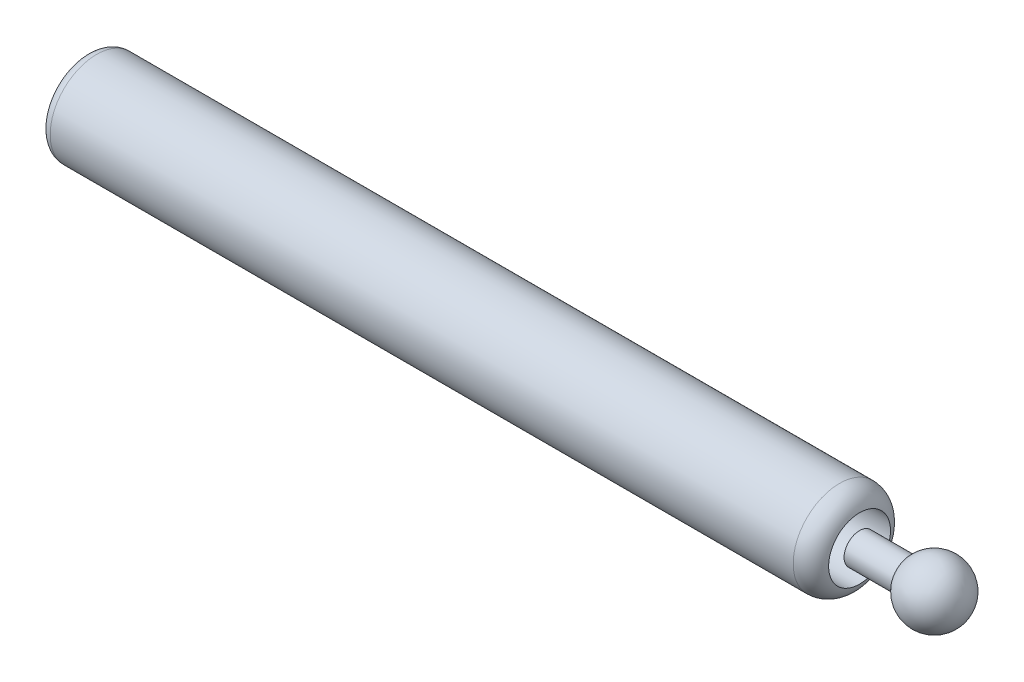
ISO-10303-21;
HEADER;
FILE_DESCRIPTION(('STEP AP214'),'2;1');
FILE_NAME('part.step','',(''),(''),'','','');
FILE_SCHEMA(('AUTOMOTIVE_DESIGN { 1 0 10303 214 1 1 1 1 }'));
ENDSEC;
DATA;
#1=APPLICATION_CONTEXT('core data for automotive mechanical design processes');
#2=APPLICATION_PROTOCOL_DEFINITION('international standard','automotive_design',2000,#1);
#3=PRODUCT_CONTEXT('',#1,'mechanical');
#4=PRODUCT('Part','Part','',(#3));
#5=PRODUCT_RELATED_PRODUCT_CATEGORY('part','',(#4));
#6=PRODUCT_DEFINITION_FORMATION('','',#4);
#7=PRODUCT_DEFINITION_CONTEXT('part definition',#1,'design');
#8=PRODUCT_DEFINITION('design','',#6,#7);
#9=PRODUCT_DEFINITION_SHAPE('','',#8);
#10=(LENGTH_UNIT() NAMED_UNIT(*) SI_UNIT(.MILLI.,.METRE.));
#11=(NAMED_UNIT(*) PLANE_ANGLE_UNIT() SI_UNIT($,.RADIAN.));
#12=(NAMED_UNIT(*) SI_UNIT($,.STERADIAN.) SOLID_ANGLE_UNIT());
#13=UNCERTAINTY_MEASURE_WITH_UNIT(LENGTH_MEASURE(1.E-05),#10,'distance_accuracy_value','');
#14=(GEOMETRIC_REPRESENTATION_CONTEXT(3) GLOBAL_UNCERTAINTY_ASSIGNED_CONTEXT((#13)) GLOBAL_UNIT_ASSIGNED_CONTEXT((#10,
#11,#12)) REPRESENTATION_CONTEXT('',''));
#15=CARTESIAN_POINT('',(0.,0.,0.));
#16=DIRECTION('',(0.,0.,1.));
#17=DIRECTION('',(1.,0.,0.));
#18=AXIS2_PLACEMENT_3D('',#15,#16,#17);
#19=CARTESIAN_POINT('',(80.,0.,0.));
#20=DIRECTION('',(-1.,0.,0.));
#21=DIRECTION('',(0.,0.,1.));
#22=AXIS2_PLACEMENT_3D('',#19,#20,#21);
#23=CYLINDRICAL_SURFACE('',#22,1.5);
#24=CARTESIAN_POINT('',(75.,0.,0.));
#25=DIRECTION('',(1.,0.,0.));
#26=DIRECTION('',(0.,0.,-1.));
#27=AXIS2_PLACEMENT_3D('',#24,#25,#26);
#28=CIRCLE('',#27,1.5);
#29=CARTESIAN_POINT('',(75.,0.,-1.5));
#30=VERTEX_POINT('',#29);
#31=EDGE_CURVE('E48',#30,#30,#28,.T.);
#32=ORIENTED_EDGE('',*,*,#31,.T.);
#33=EDGE_LOOP('',(#32));
#34=FACE_BOUND('',#33,.T.);
#35=CARTESIAN_POINT('',(79.6519237886467,0.,0.));
#36=DIRECTION('',(0.999999999999999,0.,0.));
#37=DIRECTION('',(0.,0.,-1.));
#38=AXIS2_PLACEMENT_3D('',#35,#36,#37);
#39=CIRCLE('',#38,1.5);
#40=CARTESIAN_POINT('',(79.6519237886467,0.,-1.5));
#41=VERTEX_POINT('',#40);
#42=EDGE_CURVE('E11',#41,#41,#39,.T.);
#43=ORIENTED_EDGE('',*,*,#42,.F.);
#44=EDGE_LOOP('',(#43));
#45=FACE_BOUND('',#44,.T.);
#46=ADVANCED_FACE('F42',(#34,#45),#23,.T.);
#47=CARTESIAN_POINT('',(75.,0.,0.));
#48=DIRECTION('',(1.,0.,0.));
#49=DIRECTION('',(0.,0.,-1.));
#50=AXIS2_PLACEMENT_3D('',#47,#48,#49);
#51=PLANE('',#50);
#52=ORIENTED_EDGE('',*,*,#31,.F.);
#53=EDGE_LOOP('',(#52));
#54=FACE_BOUND('',#53,.T.);
#55=ADVANCED_FACE('F56',(#54),#51,.F.);
#56=CARTESIAN_POINT('',(82.25,0.,0.));
#57=DIRECTION('',(-1.,0.,0.));
#58=DIRECTION('',(0.,0.,-1.));
#59=AXIS2_PLACEMENT_3D('',#56,#57,#58);
#60=SPHERICAL_SURFACE('',#59,2.99999999999999);
#61=ORIENTED_EDGE('',*,*,#42,.T.);
#62=EDGE_LOOP('',(#61));
#63=FACE_BOUND('',#62,.T.);
#64=ADVANCED_FACE('F58',(#63),#60,.T.);
#65=CLOSED_SHELL('',(#46,#55,#64));
#66=MANIFOLD_SOLID_BREP('B2',#65);
#67=CARTESIAN_POINT('',(75.,0.,0.));
#68=DIRECTION('',(-1.,0.,0.));
#69=DIRECTION('',(0.,0.,1.));
#70=AXIS2_PLACEMENT_3D('',#67,#68,#69);
#71=CYLINDRICAL_SURFACE('',#70,4.5);
#72=CARTESIAN_POINT('',(1.,0.,0.));
#73=DIRECTION('',(1.,0.,0.));
#74=DIRECTION('',(0.,0.,-1.));
#75=AXIS2_PLACEMENT_3D('',#72,#73,#74);
#76=CIRCLE('',#75,4.5);
#77=CARTESIAN_POINT('',(1.,0.,-4.5));
#78=VERTEX_POINT('',#77);
#79=EDGE_CURVE('E89',#78,#78,#76,.T.);
#80=ORIENTED_EDGE('',*,*,#79,.T.);
#81=EDGE_LOOP('',(#80));
#82=FACE_BOUND('',#81,.T.);
#83=CARTESIAN_POINT('',(73.0635083268963,0.,0.));
#84=DIRECTION('',(1.,0.,0.));
#85=DIRECTION('',(0.,0.,-1.));
#86=AXIS2_PLACEMENT_3D('',#83,#84,#85);
#87=CIRCLE('',#86,4.5);
#88=CARTESIAN_POINT('',(73.0635083268963,0.,-4.5));
#89=VERTEX_POINT('',#88);
#90=EDGE_CURVE('E93',#89,#89,#87,.F.);
#91=ORIENTED_EDGE('',*,*,#90,.T.);
#92=EDGE_LOOP('',(#91));
#93=FACE_BOUND('',#92,.T.);
#94=ADVANCED_FACE('F82',(#82,#93),#71,.T.);
#95=CARTESIAN_POINT('',(0.,0.,0.));
#96=DIRECTION('',(1.,0.,0.));
#97=DIRECTION('',(0.,0.,-1.));
#98=AXIS2_PLACEMENT_3D('',#95,#96,#97);
#99=PLANE('',#98);
#100=CARTESIAN_POINT('',(0.,0.,0.));
#101=DIRECTION('',(1.,0.,0.));
#102=DIRECTION('',(0.,0.,-1.));
#103=AXIS2_PLACEMENT_3D('',#100,#101,#102);
#104=CIRCLE('',#103,3.5);
#105=CARTESIAN_POINT('',(0.,0.,-3.5));
#106=VERTEX_POINT('',#105);
#107=EDGE_CURVE('E41',#106,#106,#104,.F.);
#108=ORIENTED_EDGE('',*,*,#107,.T.);
#109=EDGE_LOOP('',(#108));
#110=FACE_BOUND('',#109,.T.);
#111=CARTESIAN_POINT('',(0.,0.,0.));
#112=DIRECTION('',(-1.,0.,0.));
#113=DIRECTION('',(0.,0.,1.));
#114=AXIS2_PLACEMENT_3D('',#111,#112,#113);
#115=CIRCLE('',#114,3.);
#116=CARTESIAN_POINT('',(0.,0.,3.));
#117=VERTEX_POINT('',#116);
#118=EDGE_CURVE('E102',#117,#117,#115,.T.);
#119=ORIENTED_EDGE('',*,*,#118,.F.);
#120=EDGE_LOOP('',(#119));
#121=FACE_BOUND('',#120,.T.);
#122=ADVANCED_FACE('F108',(#110,#121),#99,.F.);
#123=CARTESIAN_POINT('',(100.,0.,0.));
#124=DIRECTION('',(-1.,0.,0.));
#125=DIRECTION('',(0.,0.,1.));
#126=AXIS2_PLACEMENT_3D('',#123,#124,#125);
#127=CYLINDRICAL_SURFACE('',#126,3.);
#128=CARTESIAN_POINT('',(75.,0.,0.));
#129=DIRECTION('',(1.,0.,0.));
#130=DIRECTION('',(0.,0.,-1.));
#131=AXIS2_PLACEMENT_3D('',#128,#129,#130);
#132=CIRCLE('',#131,3.);
#133=CARTESIAN_POINT('',(75.,0.,-3.));
#134=VERTEX_POINT('',#133);
#135=EDGE_CURVE('E97',#134,#134,#132,.T.);
#136=ORIENTED_EDGE('',*,*,#135,.T.);
#137=EDGE_LOOP('',(#136));
#138=FACE_BOUND('',#137,.T.);
#139=ORIENTED_EDGE('',*,*,#118,.T.);
#140=EDGE_LOOP('',(#139));
#141=FACE_BOUND('',#140,.T.);
#142=ADVANCED_FACE('F106',(#138,#141),#127,.F.);
#143=CARTESIAN_POINT('',(73.0635083268963,0.,0.));
#144=DIRECTION('',(1.,0.,0.));
#145=DIRECTION('',(0.,0.,-1.));
#146=AXIS2_PLACEMENT_3D('',#143,#144,#145);
#147=TOROIDAL_SURFACE('',#146,2.5,2.);
#148=ORIENTED_EDGE('',*,*,#90,.F.);
#149=EDGE_LOOP('',(#148));
#150=FACE_BOUND('',#149,.T.);
#151=ORIENTED_EDGE('',*,*,#135,.F.);
#152=EDGE_LOOP('',(#151));
#153=FACE_BOUND('',#152,.T.);
#154=ADVANCED_FACE('F115',(#150,#153),#147,.T.);
#155=CARTESIAN_POINT('',(1.,0.,0.));
#156=DIRECTION('',(1.,0.,0.));
#157=DIRECTION('',(0.,0.,-1.));
#158=AXIS2_PLACEMENT_3D('',#155,#156,#157);
#159=TOROIDAL_SURFACE('',#158,3.5,1.);
#160=ORIENTED_EDGE('',*,*,#107,.F.);
#161=EDGE_LOOP('',(#160));
#162=FACE_BOUND('',#161,.T.);
#163=ORIENTED_EDGE('',*,*,#79,.F.);
#164=EDGE_LOOP('',(#163));
#165=FACE_BOUND('',#164,.T.);
#166=ADVANCED_FACE('F84',(#162,#165),#159,.T.);
#167=CLOSED_SHELL('',(#94,#122,#142,#154,#166));
#168=MANIFOLD_SOLID_BREP('B6',#167);
#169=ADVANCED_BREP_SHAPE_REPRESENTATION('',(#18,#66,#168),#14);
#170=SHAPE_DEFINITION_REPRESENTATION(#9,#169);
ENDSEC;
END-ISO-10303-21;
